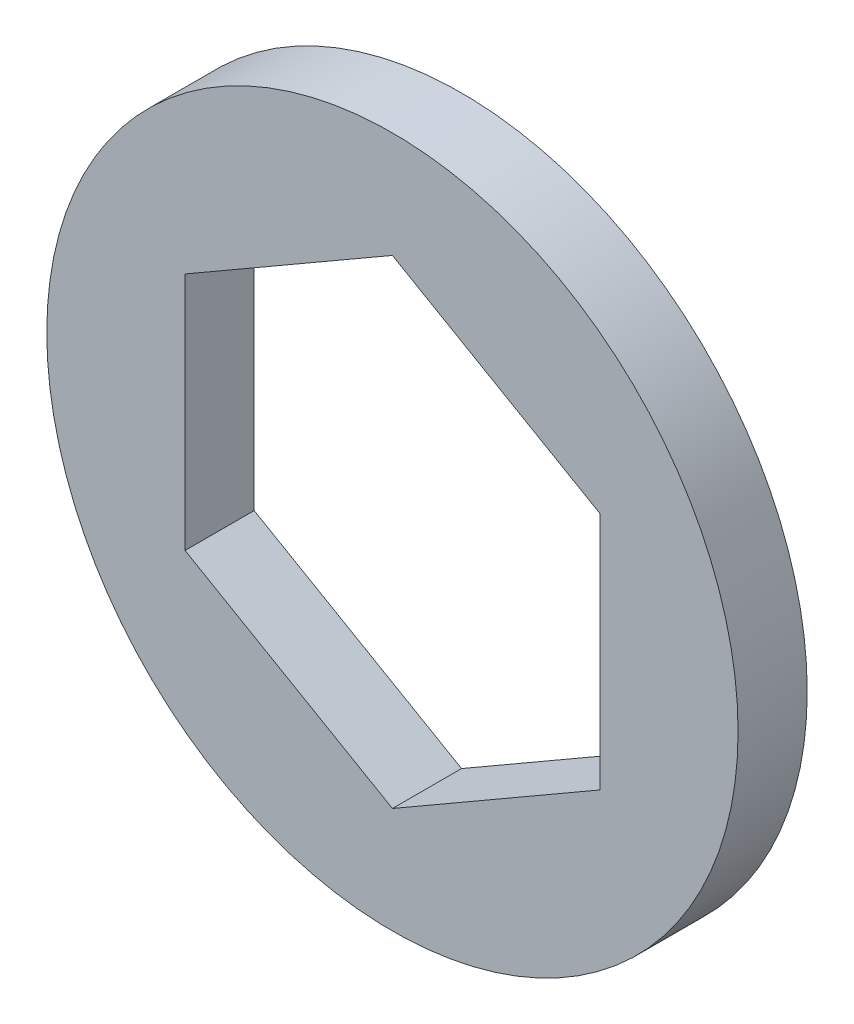
ISO-10303-21;
HEADER;
FILE_DESCRIPTION(('STEP AP214'),'2;1');
FILE_NAME('part.step','',(''),(''),'','','');
FILE_SCHEMA(('AUTOMOTIVE_DESIGN { 1 0 10303 214 1 1 1 1 }'));
ENDSEC;
DATA;
#1=APPLICATION_CONTEXT('core data for automotive mechanical design processes');
#2=APPLICATION_PROTOCOL_DEFINITION('international standard','automotive_design',2000,#1);
#3=PRODUCT_CONTEXT('',#1,'mechanical');
#4=PRODUCT('Part','Part','',(#3));
#5=PRODUCT_RELATED_PRODUCT_CATEGORY('part','',(#4));
#6=PRODUCT_DEFINITION_FORMATION('','',#4);
#7=PRODUCT_DEFINITION_CONTEXT('part definition',#1,'design');
#8=PRODUCT_DEFINITION('design','',#6,#7);
#9=PRODUCT_DEFINITION_SHAPE('','',#8);
#10=(LENGTH_UNIT() NAMED_UNIT(*) SI_UNIT(.MILLI.,.METRE.));
#11=(NAMED_UNIT(*) PLANE_ANGLE_UNIT() SI_UNIT($,.RADIAN.));
#12=(NAMED_UNIT(*) SI_UNIT($,.STERADIAN.) SOLID_ANGLE_UNIT());
#13=UNCERTAINTY_MEASURE_WITH_UNIT(LENGTH_MEASURE(1.E-05),#10,'distance_accuracy_value','');
#14=(GEOMETRIC_REPRESENTATION_CONTEXT(3) GLOBAL_UNCERTAINTY_ASSIGNED_CONTEXT((#13)) GLOBAL_UNIT_ASSIGNED_CONTEXT((#10,
#11,#12)) REPRESENTATION_CONTEXT('',''));
#15=CARTESIAN_POINT('',(0.,0.,0.));
#16=DIRECTION('',(0.,0.,1.));
#17=DIRECTION('',(1.,0.,0.));
#18=AXIS2_PLACEMENT_3D('',#15,#16,#17);
#19=CARTESIAN_POINT('',(0.,0.,1.5875));
#20=DIRECTION('',(0.,0.,1.));
#21=DIRECTION('',(1.,0.,0.));
#22=AXIS2_PLACEMENT_3D('',#19,#20,#21);
#23=PLANE('',#22);
#24=CARTESIAN_POINT('',(0.,0.,1.5875));
#25=DIRECTION('',(0.,0.,1.));
#26=DIRECTION('',(1.,0.,0.));
#27=AXIS2_PLACEMENT_3D('',#24,#25,#26);
#28=CIRCLE('',#27,7.9375);
#29=CARTESIAN_POINT('',(7.9375,0.,1.5875));
#30=VERTEX_POINT('',#29);
#31=EDGE_CURVE('E11',#30,#30,#28,.T.);
#32=ORIENTED_EDGE('',*,*,#31,.T.);
#33=EDGE_LOOP('',(#32));
#34=FACE_BOUND('',#33,.T.);
#35=DIRECTION('',(0.,-1.,0.));
#36=VECTOR('',#35,1.);
#37=CARTESIAN_POINT('',(-4.7625,2.74963065701559,1.5875));
#38=LINE('',#37,#36);
#39=CARTESIAN_POINT('',(-4.7625,2.74963065701559,1.5875));
#40=VERTEX_POINT('',#39);
#41=CARTESIAN_POINT('',(-4.7625,-2.74963065701559,1.5875));
#42=VERTEX_POINT('',#41);
#43=EDGE_CURVE('E100',#40,#42,#38,.T.);
#44=ORIENTED_EDGE('',*,*,#43,.F.);
#45=DIRECTION('',(-0.866025403784439,-0.5,0.));
#46=VECTOR('',#45,1.);
#47=CARTESIAN_POINT('',(0.,5.49926131403119,1.5875));
#48=LINE('',#47,#46);
#49=CARTESIAN_POINT('',(0.,5.49926131403119,1.5875));
#50=VERTEX_POINT('',#49);
#51=EDGE_CURVE('E92',#50,#40,#48,.T.);
#52=ORIENTED_EDGE('',*,*,#51,.F.);
#53=DIRECTION('',(-0.866025403784439,0.5,0.));
#54=VECTOR('',#53,1.);
#55=CARTESIAN_POINT('',(4.7625,2.74963065701559,1.5875));
#56=LINE('',#55,#54);
#57=CARTESIAN_POINT('',(4.7625,2.74963065701559,1.5875));
#58=VERTEX_POINT('',#57);
#59=EDGE_CURVE('E120',#58,#50,#56,.T.);
#60=ORIENTED_EDGE('',*,*,#59,.F.);
#61=DIRECTION('',(0.,1.,0.));
#62=VECTOR('',#61,1.);
#63=CARTESIAN_POINT('',(4.7625,-2.74963065701559,1.5875));
#64=LINE('',#63,#62);
#65=CARTESIAN_POINT('',(4.7625,-2.74963065701559,1.5875));
#66=VERTEX_POINT('',#65);
#67=EDGE_CURVE('E118',#66,#58,#64,.T.);
#68=ORIENTED_EDGE('',*,*,#67,.F.);
#69=DIRECTION('',(0.866025403784439,0.5,0.));
#70=VECTOR('',#69,1.);
#71=CARTESIAN_POINT('',(0.,-5.49926131403119,1.5875));
#72=LINE('',#71,#70);
#73=CARTESIAN_POINT('',(0.,-5.49926131403119,1.5875));
#74=VERTEX_POINT('',#73);
#75=EDGE_CURVE('E114',#74,#66,#72,.T.);
#76=ORIENTED_EDGE('',*,*,#75,.F.);
#77=DIRECTION('',(0.866025403784438,-0.5,0.));
#78=VECTOR('',#77,1.);
#79=CARTESIAN_POINT('',(-4.7625,-2.74963065701559,1.5875));
#80=LINE('',#79,#78);
#81=EDGE_CURVE('E112',#42,#74,#80,.T.);
#82=ORIENTED_EDGE('',*,*,#81,.F.);
#83=EDGE_LOOP('',(#44,#52,#60,#68,#76,#82));
#84=FACE_BOUND('',#83,.T.);
#85=ADVANCED_FACE('F38',(#34,#84),#23,.T.);
#86=CARTESIAN_POINT('',(0.,0.,0.));
#87=DIRECTION('',(0.,0.,1.));
#88=DIRECTION('',(1.,0.,0.));
#89=AXIS2_PLACEMENT_3D('',#86,#87,#88);
#90=PLANE('',#89);
#91=CARTESIAN_POINT('',(0.,0.,0.));
#92=DIRECTION('',(0.,0.,1.));
#93=DIRECTION('',(1.,0.,0.));
#94=AXIS2_PLACEMENT_3D('',#91,#92,#93);
#95=CIRCLE('',#94,7.9375);
#96=CARTESIAN_POINT('',(7.9375,0.,0.));
#97=VERTEX_POINT('',#96);
#98=EDGE_CURVE('E42',#97,#97,#95,.T.);
#99=ORIENTED_EDGE('',*,*,#98,.F.);
#100=EDGE_LOOP('',(#99));
#101=FACE_BOUND('',#100,.T.);
#102=DIRECTION('',(-0.866025403784439,-0.5,0.));
#103=VECTOR('',#102,1.);
#104=CARTESIAN_POINT('',(0.,5.49926131403119,0.));
#105=LINE('',#104,#103);
#106=CARTESIAN_POINT('',(0.,5.49926131403119,0.));
#107=VERTEX_POINT('',#106);
#108=CARTESIAN_POINT('',(-4.7625,2.74963065701559,0.));
#109=VERTEX_POINT('',#108);
#110=EDGE_CURVE('E62',#107,#109,#105,.T.);
#111=ORIENTED_EDGE('',*,*,#110,.T.);
#112=DIRECTION('',(0.,-1.,0.));
#113=VECTOR('',#112,1.);
#114=CARTESIAN_POINT('',(-4.7625,2.74963065701559,0.));
#115=LINE('',#114,#113);
#116=CARTESIAN_POINT('',(-4.7625,-2.74963065701559,0.));
#117=VERTEX_POINT('',#116);
#118=EDGE_CURVE('E107',#109,#117,#115,.T.);
#119=ORIENTED_EDGE('',*,*,#118,.T.);
#120=DIRECTION('',(0.866025403784438,-0.5,0.));
#121=VECTOR('',#120,1.);
#122=CARTESIAN_POINT('',(-4.7625,-2.74963065701559,0.));
#123=LINE('',#122,#121);
#124=CARTESIAN_POINT('',(0.,-5.49926131403119,0.));
#125=VERTEX_POINT('',#124);
#126=EDGE_CURVE('E125',#117,#125,#123,.T.);
#127=ORIENTED_EDGE('',*,*,#126,.T.);
#128=DIRECTION('',(0.866025403784439,0.5,0.));
#129=VECTOR('',#128,1.);
#130=CARTESIAN_POINT('',(0.,-5.49926131403119,0.));
#131=LINE('',#130,#129);
#132=CARTESIAN_POINT('',(4.7625,-2.74963065701559,0.));
#133=VERTEX_POINT('',#132);
#134=EDGE_CURVE('E128',#125,#133,#131,.T.);
#135=ORIENTED_EDGE('',*,*,#134,.T.);
#136=DIRECTION('',(0.,1.,0.));
#137=VECTOR('',#136,1.);
#138=CARTESIAN_POINT('',(4.7625,-2.74963065701559,0.));
#139=LINE('',#138,#137);
#140=CARTESIAN_POINT('',(4.7625,2.74963065701559,0.));
#141=VERTEX_POINT('',#140);
#142=EDGE_CURVE('E131',#133,#141,#139,.T.);
#143=ORIENTED_EDGE('',*,*,#142,.T.);
#144=DIRECTION('',(-0.866025403784439,0.5,0.));
#145=VECTOR('',#144,1.);
#146=CARTESIAN_POINT('',(4.7625,2.74963065701559,0.));
#147=LINE('',#146,#145);
#148=EDGE_CURVE('E101',#141,#107,#147,.T.);
#149=ORIENTED_EDGE('',*,*,#148,.T.);
#150=EDGE_LOOP('',(#111,#119,#127,#135,#143,#149));
#151=FACE_BOUND('',#150,.T.);
#152=ADVANCED_FACE('F150',(#101,#151),#90,.F.);
#153=CARTESIAN_POINT('',(0.,0.,1.5875));
#154=DIRECTION('',(0.,0.,-1.));
#155=DIRECTION('',(-1.,0.,0.));
#156=AXIS2_PLACEMENT_3D('',#153,#154,#155);
#157=CYLINDRICAL_SURFACE('',#156,7.9375);
#158=ORIENTED_EDGE('',*,*,#31,.F.);
#159=EDGE_LOOP('',(#158));
#160=FACE_BOUND('',#159,.T.);
#161=ORIENTED_EDGE('',*,*,#98,.T.);
#162=EDGE_LOOP('',(#161));
#163=FACE_BOUND('',#162,.T.);
#164=ADVANCED_FACE('F40',(#160,#163),#157,.T.);
#165=CARTESIAN_POINT('',(0.,5.49926131403119,1.5875));
#166=DIRECTION('',(0.5,-0.866025403784439,0.));
#167=DIRECTION('',(0.866025403784439,0.5,0.));
#168=AXIS2_PLACEMENT_3D('',#165,#166,#167);
#169=PLANE('',#168);
#170=ORIENTED_EDGE('',*,*,#110,.F.);
#171=DIRECTION('',(0.,0.,-1.));
#172=VECTOR('',#171,1.);
#173=CARTESIAN_POINT('',(0.,5.49926131403119,1.5875));
#174=LINE('',#173,#172);
#175=EDGE_CURVE('E96',#50,#107,#174,.T.);
#176=ORIENTED_EDGE('',*,*,#175,.F.);
#177=ORIENTED_EDGE('',*,*,#51,.T.);
#178=DIRECTION('',(0.,0.,-1.));
#179=VECTOR('',#178,1.);
#180=CARTESIAN_POINT('',(-4.7625,2.74963065701559,1.5875));
#181=LINE('',#180,#179);
#182=EDGE_CURVE('E95',#40,#109,#181,.T.);
#183=ORIENTED_EDGE('',*,*,#182,.T.);
#184=EDGE_LOOP('',(#170,#176,#177,#183));
#185=FACE_BOUND('',#184,.T.);
#186=ADVANCED_FACE('F94',(#185),#169,.T.);
#187=CARTESIAN_POINT('',(-4.7625,2.74963065701559,1.5875));
#188=DIRECTION('',(1.,0.,0.));
#189=DIRECTION('',(0.,0.,-1.));
#190=AXIS2_PLACEMENT_3D('',#187,#188,#189);
#191=PLANE('',#190);
#192=ORIENTED_EDGE('',*,*,#118,.F.);
#193=ORIENTED_EDGE('',*,*,#182,.F.);
#194=ORIENTED_EDGE('',*,*,#43,.T.);
#195=DIRECTION('',(0.,0.,-1.));
#196=VECTOR('',#195,1.);
#197=CARTESIAN_POINT('',(-4.7625,-2.74963065701559,1.5875));
#198=LINE('',#197,#196);
#199=EDGE_CURVE('E108',#42,#117,#198,.T.);
#200=ORIENTED_EDGE('',*,*,#199,.T.);
#201=EDGE_LOOP('',(#192,#193,#194,#200));
#202=FACE_BOUND('',#201,.T.);
#203=ADVANCED_FACE('F104',(#202),#191,.T.);
#204=CARTESIAN_POINT('',(-4.7625,-2.74963065701559,1.5875));
#205=DIRECTION('',(0.5,0.866025403784438,0.));
#206=DIRECTION('',(-0.866025403784439,0.5,0.));
#207=AXIS2_PLACEMENT_3D('',#204,#205,#206);
#208=PLANE('',#207);
#209=ORIENTED_EDGE('',*,*,#126,.F.);
#210=ORIENTED_EDGE('',*,*,#199,.F.);
#211=ORIENTED_EDGE('',*,*,#81,.T.);
#212=DIRECTION('',(0.,0.,-1.));
#213=VECTOR('',#212,1.);
#214=CARTESIAN_POINT('',(0.,-5.49926131403119,1.5875));
#215=LINE('',#214,#213);
#216=EDGE_CURVE('E141',#74,#125,#215,.T.);
#217=ORIENTED_EDGE('',*,*,#216,.T.);
#218=EDGE_LOOP('',(#209,#210,#211,#217));
#219=FACE_BOUND('',#218,.T.);
#220=ADVANCED_FACE('F146',(#219),#208,.T.);
#221=CARTESIAN_POINT('',(0.,-5.49926131403119,1.5875));
#222=DIRECTION('',(-0.5,0.866025403784438,0.));
#223=DIRECTION('',(-0.866025403784439,-0.5,0.));
#224=AXIS2_PLACEMENT_3D('',#221,#222,#223);
#225=PLANE('',#224);
#226=ORIENTED_EDGE('',*,*,#134,.F.);
#227=ORIENTED_EDGE('',*,*,#216,.F.);
#228=ORIENTED_EDGE('',*,*,#75,.T.);
#229=DIRECTION('',(0.,0.,-1.));
#230=VECTOR('',#229,1.);
#231=CARTESIAN_POINT('',(4.7625,-2.74963065701559,1.5875));
#232=LINE('',#231,#230);
#233=EDGE_CURVE('E139',#66,#133,#232,.T.);
#234=ORIENTED_EDGE('',*,*,#233,.T.);
#235=EDGE_LOOP('',(#226,#227,#228,#234));
#236=FACE_BOUND('',#235,.T.);
#237=ADVANCED_FACE('F158',(#236),#225,.T.);
#238=CARTESIAN_POINT('',(4.7625,-2.74963065701559,1.5875));
#239=DIRECTION('',(-1.,0.,0.));
#240=DIRECTION('',(0.,0.,1.));
#241=AXIS2_PLACEMENT_3D('',#238,#239,#240);
#242=PLANE('',#241);
#243=ORIENTED_EDGE('',*,*,#142,.F.);
#244=ORIENTED_EDGE('',*,*,#233,.F.);
#245=ORIENTED_EDGE('',*,*,#67,.T.);
#246=DIRECTION('',(0.,0.,-1.));
#247=VECTOR('',#246,1.);
#248=CARTESIAN_POINT('',(4.7625,2.74963065701559,1.5875));
#249=LINE('',#248,#247);
#250=EDGE_CURVE('E54',#58,#141,#249,.T.);
#251=ORIENTED_EDGE('',*,*,#250,.T.);
#252=EDGE_LOOP('',(#243,#244,#245,#251));
#253=FACE_BOUND('',#252,.T.);
#254=ADVANCED_FACE('F156',(#253),#242,.T.);
#255=CARTESIAN_POINT('',(4.7625,2.74963065701559,1.5875));
#256=DIRECTION('',(-0.5,-0.866025403784439,0.));
#257=DIRECTION('',(0.866025403784439,-0.5,0.));
#258=AXIS2_PLACEMENT_3D('',#255,#256,#257);
#259=PLANE('',#258);
#260=ORIENTED_EDGE('',*,*,#148,.F.);
#261=ORIENTED_EDGE('',*,*,#250,.F.);
#262=ORIENTED_EDGE('',*,*,#59,.T.);
#263=ORIENTED_EDGE('',*,*,#175,.T.);
#264=EDGE_LOOP('',(#260,#261,#262,#263));
#265=FACE_BOUND('',#264,.T.);
#266=ADVANCED_FACE('F152',(#265),#259,.T.);
#267=CLOSED_SHELL('',(#85,#152,#164,#186,#203,#220,#237,#254,#266));
#268=MANIFOLD_SOLID_BREP('B2',#267);
#269=ADVANCED_BREP_SHAPE_REPRESENTATION('',(#18,#268),#14);
#270=SHAPE_DEFINITION_REPRESENTATION(#9,#269);
ENDSEC;
END-ISO-10303-21;
